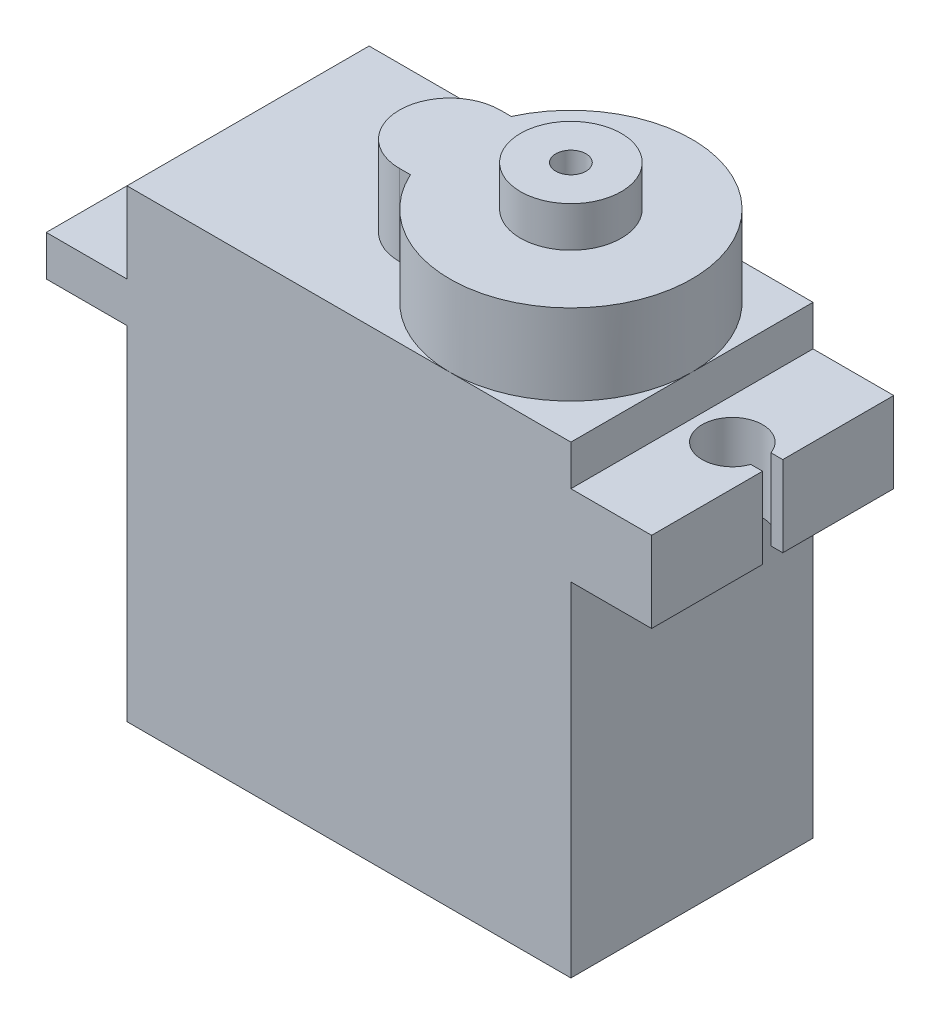
ISO-10303-21;
HEADER;
FILE_DESCRIPTION(('STEP AP214'),'2;1');
FILE_NAME('part.step','',(''),(''),'','','');
FILE_SCHEMA(('AUTOMOTIVE_DESIGN { 1 0 10303 214 1 1 1 1 }'));
ENDSEC;
DATA;
#1=APPLICATION_CONTEXT('core data for automotive mechanical design processes');
#2=APPLICATION_PROTOCOL_DEFINITION('international standard','automotive_design',2000,#1);
#3=PRODUCT_CONTEXT('',#1,'mechanical');
#4=PRODUCT('Part','Part','',(#3));
#5=PRODUCT_RELATED_PRODUCT_CATEGORY('part','',(#4));
#6=PRODUCT_DEFINITION_FORMATION('','',#4);
#7=PRODUCT_DEFINITION_CONTEXT('part definition',#1,'design');
#8=PRODUCT_DEFINITION('design','',#6,#7);
#9=PRODUCT_DEFINITION_SHAPE('','',#8);
#10=(LENGTH_UNIT() NAMED_UNIT(*) SI_UNIT(.MILLI.,.METRE.));
#11=(NAMED_UNIT(*) PLANE_ANGLE_UNIT() SI_UNIT($,.RADIAN.));
#12=(NAMED_UNIT(*) SI_UNIT($,.STERADIAN.) SOLID_ANGLE_UNIT());
#13=UNCERTAINTY_MEASURE_WITH_UNIT(LENGTH_MEASURE(1.E-05),#10,'distance_accuracy_value','');
#14=(GEOMETRIC_REPRESENTATION_CONTEXT(3) GLOBAL_UNCERTAINTY_ASSIGNED_CONTEXT((#13)) GLOBAL_UNIT_ASSIGNED_CONTEXT((#10,
#11,#12)) REPRESENTATION_CONTEXT('',''));
#15=CARTESIAN_POINT('',(0.,0.,0.));
#16=DIRECTION('',(0.,0.,1.));
#17=DIRECTION('',(1.,0.,0.));
#18=AXIS2_PLACEMENT_3D('',#15,#16,#17);
#19=CARTESIAN_POINT('',(-36.1403279553093,11.0751421184563,12.));
#20=DIRECTION('',(0.,-1.,0.));
#21=DIRECTION('',(0.,0.,-1.));
#22=AXIS2_PLACEMENT_3D('',#19,#20,#21);
#23=PLANE('',#22);
#24=DIRECTION('',(1.,0.,0.));
#25=VECTOR('',#24,1.);
#26=CARTESIAN_POINT('',(0.,11.0751421184563,3.5));
#27=LINE('',#26,#25);
#28=CARTESIAN_POINT('',(-26.1403279553093,11.0751421184563,3.5));
#29=VERTEX_POINT('',#28);
#30=CARTESIAN_POINT('',(-25.5946840126272,11.0751421184563,3.5));
#31=VERTEX_POINT('',#30);
#32=EDGE_CURVE('E245',#29,#31,#27,.T.);
#33=ORIENTED_EDGE('',*,*,#32,.T.);
#34=CARTESIAN_POINT('',(-20.1403279553093,11.0751421184563,6.));
#35=DIRECTION('',(0.,1.,0.));
#36=DIRECTION('',(0.,0.,1.));
#37=AXIS2_PLACEMENT_3D('',#34,#35,#36);
#38=CIRCLE('',#37,6.);
#39=CARTESIAN_POINT('',(-20.1403279553093,11.0751421184563,0.));
#40=VERTEX_POINT('',#39);
#41=EDGE_CURVE('E56',#31,#40,#38,.F.);
#42=ORIENTED_EDGE('',*,*,#41,.T.);
#43=DIRECTION('',(-1.,0.,0.));
#44=VECTOR('',#43,1.);
#45=CARTESIAN_POINT('',(-36.1403279553093,11.0751421184563,0.));
#46=LINE('',#45,#44);
#47=CARTESIAN_POINT('',(-36.1403279553093,11.0751421184563,0.));
#48=VERTEX_POINT('',#47);
#49=EDGE_CURVE('E391',#40,#48,#46,.T.);
#50=ORIENTED_EDGE('',*,*,#49,.T.);
#51=DIRECTION('',(0.,0.,-1.));
#52=VECTOR('',#51,1.);
#53=CARTESIAN_POINT('',(-36.1403279553093,11.0751421184563,12.));
#54=LINE('',#53,#52);
#55=CARTESIAN_POINT('',(-36.1403279553093,11.0751421184563,12.));
#56=VERTEX_POINT('',#55);
#57=EDGE_CURVE('E382',#56,#48,#54,.T.);
#58=ORIENTED_EDGE('',*,*,#57,.F.);
#59=DIRECTION('',(-1.,0.,0.));
#60=VECTOR('',#59,1.);
#61=CARTESIAN_POINT('',(-36.1403279553093,11.0751421184563,12.));
#62=LINE('',#61,#60);
#63=CARTESIAN_POINT('',(-20.1403279553093,11.0751421184563,12.));
#64=VERTEX_POINT('',#63);
#65=EDGE_CURVE('E378',#64,#56,#62,.T.);
#66=ORIENTED_EDGE('',*,*,#65,.F.);
#67=CARTESIAN_POINT('',(-25.5946840126272,11.0751421184563,8.5));
#68=VERTEX_POINT('',#67);
#69=EDGE_CURVE('E246',#64,#68,#38,.F.);
#70=ORIENTED_EDGE('',*,*,#69,.T.);
#71=DIRECTION('',(1.,0.,0.));
#72=VECTOR('',#71,1.);
#73=CARTESIAN_POINT('',(0.,11.0751421184563,8.5));
#74=LINE('',#73,#72);
#75=CARTESIAN_POINT('',(-26.1403279553093,11.0751421184563,8.5));
#76=VERTEX_POINT('',#75);
#77=EDGE_CURVE('E235',#76,#68,#74,.T.);
#78=ORIENTED_EDGE('',*,*,#77,.F.);
#79=CARTESIAN_POINT('',(-26.1403279553093,11.0751421184563,6.));
#80=DIRECTION('',(0.,1.,0.));
#81=DIRECTION('',(0.,0.,1.));
#82=AXIS2_PLACEMENT_3D('',#79,#80,#81);
#83=CIRCLE('',#82,2.5);
#84=EDGE_CURVE('E248',#76,#29,#83,.F.);
#85=ORIENTED_EDGE('',*,*,#84,.T.);
#86=EDGE_LOOP('',(#33,#42,#50,#58,#66,#70,#78,#85));
#87=FACE_BOUND('',#86,.T.);
#88=ADVANCED_FACE('F45',(#87),#23,.F.);
#89=CARTESIAN_POINT('',(-14.1403279553093,11.0751421184563,0.));
#90=VERTEX_POINT('',#89);
#91=EDGE_CURVE('E392',#90,#40,#46,.T.);
#92=ORIENTED_EDGE('',*,*,#91,.T.);
#93=CARTESIAN_POINT('',(-14.1403279553093,11.0751421184563,6.));
#94=VERTEX_POINT('',#93);
#95=EDGE_CURVE('E11',#40,#94,#38,.F.);
#96=ORIENTED_EDGE('',*,*,#95,.T.);
#97=DIRECTION('',(0.,0.,-1.));
#98=VECTOR('',#97,1.);
#99=CARTESIAN_POINT('',(-14.1403279553093,11.0751421184563,12.));
#100=LINE('',#99,#98);
#101=EDGE_CURVE('E397',#94,#90,#100,.T.);
#102=ORIENTED_EDGE('',*,*,#101,.T.);
#103=EDGE_LOOP('',(#92,#96,#102));
#104=FACE_BOUND('',#103,.T.);
#105=ADVANCED_FACE('F431',(#104),#23,.F.);
#106=CARTESIAN_POINT('',(-40.1403279553093,0.,0.));
#107=DIRECTION('',(1.,0.,0.));
#108=DIRECTION('',(0.,0.,-1.));
#109=AXIS2_PLACEMENT_3D('',#106,#107,#108);
#110=PLANE('',#109);
#111=DIRECTION('',(0.,0.,1.));
#112=VECTOR('',#111,1.);
#113=CARTESIAN_POINT('',(-40.1403279553093,5.0751421184563,12.));
#114=LINE('',#113,#112);
#115=CARTESIAN_POINT('',(-40.1403279553093,5.0751421184563,0.));
#116=VERTEX_POINT('',#115);
#117=CARTESIAN_POINT('',(-40.1403279553093,5.0751421184563,5.5));
#118=VERTEX_POINT('',#117);
#119=EDGE_CURVE('E286',#116,#118,#114,.T.);
#120=ORIENTED_EDGE('',*,*,#119,.T.);
#121=DIRECTION('',(0.,1.,0.));
#122=VECTOR('',#121,1.);
#123=CARTESIAN_POINT('',(-40.1403279553093,5.0751421184563,5.5));
#124=LINE('',#123,#122);
#125=CARTESIAN_POINT('',(-40.1403279553093,7.0751421184563,5.5));
#126=VERTEX_POINT('',#125);
#127=EDGE_CURVE('E265',#118,#126,#124,.T.);
#128=ORIENTED_EDGE('',*,*,#127,.T.);
#129=DIRECTION('',(0.,0.,-1.));
#130=VECTOR('',#129,1.);
#131=CARTESIAN_POINT('',(-40.1403279553093,7.0751421184563,0.));
#132=LINE('',#131,#130);
#133=CARTESIAN_POINT('',(-40.1403279553093,7.0751421184563,0.));
#134=VERTEX_POINT('',#133);
#135=EDGE_CURVE('E291',#126,#134,#132,.T.);
#136=ORIENTED_EDGE('',*,*,#135,.T.);
#137=DIRECTION('',(0.,-1.,0.));
#138=VECTOR('',#137,1.);
#139=CARTESIAN_POINT('',(-40.1403279553093,5.0751421184563,0.));
#140=LINE('',#139,#138);
#141=EDGE_CURVE('E281',#134,#116,#140,.T.);
#142=ORIENTED_EDGE('',*,*,#141,.T.);
#143=EDGE_LOOP('',(#120,#128,#136,#142));
#144=FACE_BOUND('',#143,.T.);
#145=ADVANCED_FACE('F505',(#144),#110,.F.);
#146=CARTESIAN_POINT('',(-36.1403279553093,-11.9248578815437,12.));
#147=DIRECTION('',(1.,0.,0.));
#148=DIRECTION('',(0.,0.,-1.));
#149=AXIS2_PLACEMENT_3D('',#146,#147,#148);
#150=PLANE('',#149);
#151=DIRECTION('',(0.,0.,-1.));
#152=VECTOR('',#151,1.);
#153=CARTESIAN_POINT('',(-36.1403279553093,7.0751421184563,0.));
#154=LINE('',#153,#152);
#155=CARTESIAN_POINT('',(-36.1403279553093,7.0751421184563,12.));
#156=VERTEX_POINT('',#155);
#157=CARTESIAN_POINT('',(-36.1403279553093,7.0751421184563,0.));
#158=VERTEX_POINT('',#157);
#159=EDGE_CURVE('E285',#156,#158,#154,.T.);
#160=ORIENTED_EDGE('',*,*,#159,.F.);
#161=DIRECTION('',(0.,-1.,0.));
#162=VECTOR('',#161,1.);
#163=CARTESIAN_POINT('',(-36.1403279553093,-11.9248578815437,12.));
#164=LINE('',#163,#162);
#165=EDGE_CURVE('E368',#56,#156,#164,.T.);
#166=ORIENTED_EDGE('',*,*,#165,.F.);
#167=ORIENTED_EDGE('',*,*,#57,.T.);
#168=DIRECTION('',(0.,-1.,0.));
#169=VECTOR('',#168,1.);
#170=CARTESIAN_POINT('',(-36.1403279553093,-11.9248578815437,0.));
#171=LINE('',#170,#169);
#172=EDGE_CURVE('E383',#48,#158,#171,.T.);
#173=ORIENTED_EDGE('',*,*,#172,.T.);
#174=EDGE_LOOP('',(#160,#166,#167,#173));
#175=FACE_BOUND('',#174,.T.);
#176=ADVANCED_FACE('F47',(#175),#150,.F.);
#177=DIRECTION('',(0.,0.,1.));
#178=VECTOR('',#177,1.);
#179=CARTESIAN_POINT('',(-36.1403279553093,5.0751421184563,12.));
#180=LINE('',#179,#178);
#181=CARTESIAN_POINT('',(-36.1403279553093,5.0751421184563,0.));
#182=VERTEX_POINT('',#181);
#183=CARTESIAN_POINT('',(-36.1403279553093,5.0751421184563,12.));
#184=VERTEX_POINT('',#183);
#185=EDGE_CURVE('E274',#182,#184,#180,.T.);
#186=ORIENTED_EDGE('',*,*,#185,.F.);
#187=CARTESIAN_POINT('',(-36.1403279553093,-11.9248578815437,0.));
#188=VERTEX_POINT('',#187);
#189=EDGE_CURVE('E367',#182,#188,#171,.T.);
#190=ORIENTED_EDGE('',*,*,#189,.T.);
#191=DIRECTION('',(0.,0.,-1.));
#192=VECTOR('',#191,1.);
#193=CARTESIAN_POINT('',(-36.1403279553093,-11.9248578815437,12.));
#194=LINE('',#193,#192);
#195=CARTESIAN_POINT('',(-36.1403279553093,-11.9248578815437,12.));
#196=VERTEX_POINT('',#195);
#197=EDGE_CURVE('E403',#196,#188,#194,.T.);
#198=ORIENTED_EDGE('',*,*,#197,.F.);
#199=EDGE_CURVE('E372',#184,#196,#164,.T.);
#200=ORIENTED_EDGE('',*,*,#199,.F.);
#201=EDGE_LOOP('',(#186,#190,#198,#200));
#202=FACE_BOUND('',#201,.T.);
#203=ADVANCED_FACE('F456',(#202),#150,.F.);
#204=CARTESIAN_POINT('',(0.,0.,12.));
#205=DIRECTION('',(0.,0.,-1.));
#206=DIRECTION('',(-1.,0.,0.));
#207=AXIS2_PLACEMENT_3D('',#204,#205,#206);
#208=PLANE('',#207);
#209=DIRECTION('',(0.,1.,0.));
#210=VECTOR('',#209,1.);
#211=CARTESIAN_POINT('',(-10.1403279553093,5.0751421184563,12.));
#212=LINE('',#211,#210);
#213=CARTESIAN_POINT('',(-10.1403279553093,5.0751421184563,12.));
#214=VERTEX_POINT('',#213);
#215=CARTESIAN_POINT('',(-10.1403279553093,9.07514211845631,12.));
#216=VERTEX_POINT('',#215);
#217=EDGE_CURVE('E349',#214,#216,#212,.T.);
#218=ORIENTED_EDGE('',*,*,#217,.T.);
#219=DIRECTION('',(-1.,0.,0.));
#220=VECTOR('',#219,1.);
#221=CARTESIAN_POINT('',(-9.1403279553093,9.0751421184563,12.));
#222=LINE('',#221,#220);
#223=CARTESIAN_POINT('',(-14.1403279553093,9.0751421184563,12.));
#224=VERTEX_POINT('',#223);
#225=EDGE_CURVE('E329',#216,#224,#222,.T.);
#226=ORIENTED_EDGE('',*,*,#225,.T.);
#227=DIRECTION('',(0.,1.,0.));
#228=VECTOR('',#227,1.);
#229=CARTESIAN_POINT('',(-14.1403279553093,11.0751421184563,12.));
#230=LINE('',#229,#228);
#231=CARTESIAN_POINT('',(-14.1403279553093,11.0751421184563,12.));
#232=VERTEX_POINT('',#231);
#233=EDGE_CURVE('E374',#224,#232,#230,.T.);
#234=ORIENTED_EDGE('',*,*,#233,.T.);
#235=EDGE_CURVE('E379',#232,#64,#62,.T.);
#236=ORIENTED_EDGE('',*,*,#235,.T.);
#237=ORIENTED_EDGE('',*,*,#65,.T.);
#238=ORIENTED_EDGE('',*,*,#165,.T.);
#239=DIRECTION('',(1.,0.,0.));
#240=VECTOR('',#239,1.);
#241=CARTESIAN_POINT('',(-40.1403279553093,7.0751421184563,12.));
#242=LINE('',#241,#240);
#243=CARTESIAN_POINT('',(-40.1403279553093,7.0751421184563,12.));
#244=VERTEX_POINT('',#243);
#245=EDGE_CURVE('E302',#244,#156,#242,.T.);
#246=ORIENTED_EDGE('',*,*,#245,.F.);
#247=DIRECTION('',(0.,1.,0.));
#248=VECTOR('',#247,1.);
#249=CARTESIAN_POINT('',(-40.1403279553093,7.0751421184563,12.));
#250=LINE('',#249,#248);
#251=CARTESIAN_POINT('',(-40.1403279553093,5.0751421184563,12.));
#252=VERTEX_POINT('',#251);
#253=EDGE_CURVE('E289',#252,#244,#250,.T.);
#254=ORIENTED_EDGE('',*,*,#253,.F.);
#255=DIRECTION('',(1.,0.,0.));
#256=VECTOR('',#255,1.);
#257=CARTESIAN_POINT('',(-40.1403279553093,5.0751421184563,12.));
#258=LINE('',#257,#256);
#259=EDGE_CURVE('E305',#252,#184,#258,.T.);
#260=ORIENTED_EDGE('',*,*,#259,.T.);
#261=ORIENTED_EDGE('',*,*,#199,.T.);
#262=DIRECTION('',(1.,0.,0.));
#263=VECTOR('',#262,1.);
#264=CARTESIAN_POINT('',(-14.1403279553093,-11.9248578815437,12.));
#265=LINE('',#264,#263);
#266=CARTESIAN_POINT('',(-14.1403279553093,-11.9248578815437,12.));
#267=VERTEX_POINT('',#266);
#268=EDGE_CURVE('E371',#196,#267,#265,.T.);
#269=ORIENTED_EDGE('',*,*,#268,.T.);
#270=CARTESIAN_POINT('',(-14.1403279553093,5.0751421184563,12.));
#271=VERTEX_POINT('',#270);
#272=EDGE_CURVE('E375',#267,#271,#230,.T.);
#273=ORIENTED_EDGE('',*,*,#272,.T.);
#274=DIRECTION('',(-1.,0.,0.));
#275=VECTOR('',#274,1.);
#276=CARTESIAN_POINT('',(-9.1403279553093,5.0751421184563,12.));
#277=LINE('',#276,#275);
#278=EDGE_CURVE('E365',#214,#271,#277,.T.);
#279=ORIENTED_EDGE('',*,*,#278,.F.);
#280=EDGE_LOOP('',(#218,#226,#234,#236,#237,#238,#246,#254,#260,#261,#269,#273,#279));
#281=FACE_BOUND('',#280,.T.);
#282=ADVANCED_FACE('F420',(#281),#208,.F.);
#283=CARTESIAN_POINT('',(0.,0.,0.));
#284=DIRECTION('',(0.,0.,-1.));
#285=DIRECTION('',(-1.,0.,0.));
#286=AXIS2_PLACEMENT_3D('',#283,#284,#285);
#287=PLANE('',#286);
#288=DIRECTION('',(-1.,0.,0.));
#289=VECTOR('',#288,1.);
#290=CARTESIAN_POINT('',(-9.1403279553093,9.07514211845631,0.));
#291=LINE('',#290,#289);
#292=CARTESIAN_POINT('',(-10.1403279553093,9.07514211845631,0.));
#293=VERTEX_POINT('',#292);
#294=CARTESIAN_POINT('',(-14.1403279553093,9.07514211845631,0.));
#295=VERTEX_POINT('',#294);
#296=EDGE_CURVE('E331',#293,#295,#291,.T.);
#297=ORIENTED_EDGE('',*,*,#296,.F.);
#298=DIRECTION('',(0.,1.,0.));
#299=VECTOR('',#298,1.);
#300=CARTESIAN_POINT('',(-10.1403279553093,5.0751421184563,0.));
#301=LINE('',#300,#299);
#302=CARTESIAN_POINT('',(-10.1403279553093,5.0751421184563,0.));
#303=VERTEX_POINT('',#302);
#304=EDGE_CURVE('E348',#303,#293,#301,.T.);
#305=ORIENTED_EDGE('',*,*,#304,.F.);
#306=DIRECTION('',(-1.,0.,0.));
#307=VECTOR('',#306,1.);
#308=CARTESIAN_POINT('',(-9.1403279553093,5.0751421184563,0.));
#309=LINE('',#308,#307);
#310=CARTESIAN_POINT('',(-14.1403279553093,5.0751421184563,0.));
#311=VERTEX_POINT('',#310);
#312=EDGE_CURVE('E363',#303,#311,#309,.T.);
#313=ORIENTED_EDGE('',*,*,#312,.T.);
#314=DIRECTION('',(0.,1.,0.));
#315=VECTOR('',#314,1.);
#316=CARTESIAN_POINT('',(-14.1403279553093,11.0751421184563,0.));
#317=LINE('',#316,#315);
#318=CARTESIAN_POINT('',(-14.1403279553093,-11.9248578815437,0.));
#319=VERTEX_POINT('',#318);
#320=EDGE_CURVE('E388',#319,#311,#317,.T.);
#321=ORIENTED_EDGE('',*,*,#320,.F.);
#322=DIRECTION('',(1.,0.,0.));
#323=VECTOR('',#322,1.);
#324=CARTESIAN_POINT('',(-14.1403279553093,-11.9248578815437,0.));
#325=LINE('',#324,#323);
#326=EDGE_CURVE('E385',#188,#319,#325,.T.);
#327=ORIENTED_EDGE('',*,*,#326,.F.);
#328=ORIENTED_EDGE('',*,*,#189,.F.);
#329=DIRECTION('',(1.,0.,0.));
#330=VECTOR('',#329,1.);
#331=CARTESIAN_POINT('',(-40.1403279553093,5.0751421184563,0.));
#332=LINE('',#331,#330);
#333=EDGE_CURVE('E308',#116,#182,#332,.T.);
#334=ORIENTED_EDGE('',*,*,#333,.F.);
#335=ORIENTED_EDGE('',*,*,#141,.F.);
#336=DIRECTION('',(1.,0.,0.));
#337=VECTOR('',#336,1.);
#338=CARTESIAN_POINT('',(-40.1403279553093,7.0751421184563,0.));
#339=LINE('',#338,#337);
#340=EDGE_CURVE('E295',#134,#158,#339,.T.);
#341=ORIENTED_EDGE('',*,*,#340,.T.);
#342=ORIENTED_EDGE('',*,*,#172,.F.);
#343=ORIENTED_EDGE('',*,*,#49,.F.);
#344=ORIENTED_EDGE('',*,*,#91,.F.);
#345=EDGE_CURVE('E387',#295,#90,#317,.T.);
#346=ORIENTED_EDGE('',*,*,#345,.F.);
#347=EDGE_LOOP('',(#297,#305,#313,#321,#327,#328,#334,#335,#341,#342,#343,#344,#346));
#348=FACE_BOUND('',#347,.T.);
#349=ADVANCED_FACE('F436',(#348),#287,.T.);
#350=CARTESIAN_POINT('',(-9.1403279553093,9.07514211845631,0.));
#351=DIRECTION('',(0.,1.,0.));
#352=DIRECTION('',(-1.,0.,0.));
#353=AXIS2_PLACEMENT_3D('',#350,#351,#352);
#354=PLANE('',#353);
#355=DIRECTION('',(-1.,0.,0.));
#356=VECTOR('',#355,1.);
#357=CARTESIAN_POINT('',(-10.1403279553093,9.07514211845631,5.5));
#358=LINE('',#357,#356);
#359=CARTESIAN_POINT('',(-10.1403279553093,9.07514211845631,5.5));
#360=VERTEX_POINT('',#359);
#361=CARTESIAN_POINT('',(-10.7261143929362,9.07514211845631,5.5));
#362=VERTEX_POINT('',#361);
#363=EDGE_CURVE('E320',#360,#362,#358,.T.);
#364=ORIENTED_EDGE('',*,*,#363,.F.);
#365=DIRECTION('',(0.,0.,1.));
#366=VECTOR('',#365,1.);
#367=CARTESIAN_POINT('',(-10.1403279553093,9.07514211845631,5.5));
#368=LINE('',#367,#366);
#369=EDGE_CURVE('E323',#293,#360,#368,.T.);
#370=ORIENTED_EDGE('',*,*,#369,.F.);
#371=ORIENTED_EDGE('',*,*,#296,.T.);
#372=DIRECTION('',(0.,0.,-1.));
#373=VECTOR('',#372,1.);
#374=CARTESIAN_POINT('',(-14.1403279553093,9.07514211845631,0.));
#375=LINE('',#374,#373);
#376=EDGE_CURVE('E326',#224,#295,#375,.T.);
#377=ORIENTED_EDGE('',*,*,#376,.F.);
#378=ORIENTED_EDGE('',*,*,#225,.F.);
#379=DIRECTION('',(0.,0.,1.));
#380=VECTOR('',#379,1.);
#381=CARTESIAN_POINT('',(-10.1403279553093,9.07514211845631,12.));
#382=LINE('',#381,#380);
#383=CARTESIAN_POINT('',(-10.1403279553093,9.07514211845631,6.5));
#384=VERTEX_POINT('',#383);
#385=EDGE_CURVE('E311',#384,#216,#382,.T.);
#386=ORIENTED_EDGE('',*,*,#385,.F.);
#387=DIRECTION('',(1.,0.,0.));
#388=VECTOR('',#387,1.);
#389=CARTESIAN_POINT('',(-10.7261143929362,9.07514211845631,6.5));
#390=LINE('',#389,#388);
#391=CARTESIAN_POINT('',(-10.7261143929362,9.07514211845631,6.5));
#392=VERTEX_POINT('',#391);
#393=EDGE_CURVE('E314',#392,#384,#390,.T.);
#394=ORIENTED_EDGE('',*,*,#393,.F.);
#395=CARTESIAN_POINT('',(-12.1403279553093,9.07514211845631,6.));
#396=DIRECTION('',(0.,1.,0.));
#397=DIRECTION('',(1.,0.,0.));
#398=AXIS2_PLACEMENT_3D('',#395,#396,#397);
#399=CIRCLE('',#398,1.5);
#400=EDGE_CURVE('E317',#362,#392,#399,.T.);
#401=ORIENTED_EDGE('',*,*,#400,.F.);
#402=EDGE_LOOP('',(#364,#370,#371,#377,#378,#386,#394,#401));
#403=FACE_BOUND('',#402,.T.);
#404=ADVANCED_FACE('F477',(#403),#354,.T.);
#405=CARTESIAN_POINT('',(-14.1403279553093,11.0751421184563,12.));
#406=DIRECTION('',(-1.,0.,0.));
#407=DIRECTION('',(0.,-1.,0.));
#408=AXIS2_PLACEMENT_3D('',#405,#406,#407);
#409=PLANE('',#408);
#410=ORIENTED_EDGE('',*,*,#233,.F.);
#411=ORIENTED_EDGE('',*,*,#376,.T.);
#412=ORIENTED_EDGE('',*,*,#345,.T.);
#413=ORIENTED_EDGE('',*,*,#101,.F.);
#414=EDGE_CURVE('E398',#232,#94,#100,.T.);
#415=ORIENTED_EDGE('',*,*,#414,.F.);
#416=EDGE_LOOP('',(#410,#411,#412,#413,#415));
#417=FACE_BOUND('',#416,.T.);
#418=ADVANCED_FACE('F426',(#417),#409,.F.);
#419=DIRECTION('',(0.,0.,-1.));
#420=VECTOR('',#419,1.);
#421=CARTESIAN_POINT('',(-14.1403279553093,5.0751421184563,0.));
#422=LINE('',#421,#420);
#423=EDGE_CURVE('E351',#271,#311,#422,.T.);
#424=ORIENTED_EDGE('',*,*,#423,.F.);
#425=ORIENTED_EDGE('',*,*,#272,.F.);
#426=DIRECTION('',(0.,0.,-1.));
#427=VECTOR('',#426,1.);
#428=CARTESIAN_POINT('',(-14.1403279553093,-11.9248578815437,12.));
#429=LINE('',#428,#427);
#430=EDGE_CURVE('E401',#267,#319,#429,.T.);
#431=ORIENTED_EDGE('',*,*,#430,.T.);
#432=ORIENTED_EDGE('',*,*,#320,.T.);
#433=EDGE_LOOP('',(#424,#425,#431,#432));
#434=FACE_BOUND('',#433,.T.);
#435=ADVANCED_FACE('F464',(#434),#409,.F.);
#436=CARTESIAN_POINT('',(-14.1403279553093,-11.9248578815437,12.));
#437=DIRECTION('',(0.,1.,0.));
#438=DIRECTION('',(0.,0.,1.));
#439=AXIS2_PLACEMENT_3D('',#436,#437,#438);
#440=PLANE('',#439);
#441=ORIENTED_EDGE('',*,*,#326,.T.);
#442=ORIENTED_EDGE('',*,*,#430,.F.);
#443=ORIENTED_EDGE('',*,*,#268,.F.);
#444=ORIENTED_EDGE('',*,*,#197,.T.);
#445=EDGE_LOOP('',(#441,#442,#443,#444));
#446=FACE_BOUND('',#445,.T.);
#447=ADVANCED_FACE('F460',(#446),#440,.F.);
#448=ORIENTED_EDGE('',*,*,#414,.T.);
#449=EDGE_CURVE('E54',#94,#64,#38,.F.);
#450=ORIENTED_EDGE('',*,*,#449,.T.);
#451=ORIENTED_EDGE('',*,*,#235,.F.);
#452=EDGE_LOOP('',(#448,#450,#451));
#453=FACE_BOUND('',#452,.T.);
#454=ADVANCED_FACE('F415',(#453),#23,.F.);
#455=CARTESIAN_POINT('',(-9.1403279553093,5.0751421184563,0.));
#456=DIRECTION('',(0.,1.,0.));
#457=DIRECTION('',(-1.,0.,0.));
#458=AXIS2_PLACEMENT_3D('',#455,#456,#457);
#459=PLANE('',#458);
#460=DIRECTION('',(1.,0.,0.));
#461=VECTOR('',#460,1.);
#462=CARTESIAN_POINT('',(-10.7261143929362,5.0751421184563,6.5));
#463=LINE('',#462,#461);
#464=CARTESIAN_POINT('',(-10.7261143929362,5.0751421184563,6.5));
#465=VERTEX_POINT('',#464);
#466=CARTESIAN_POINT('',(-10.1403279553093,5.0751421184563,6.5));
#467=VERTEX_POINT('',#466);
#468=EDGE_CURVE('E342',#465,#467,#463,.T.);
#469=ORIENTED_EDGE('',*,*,#468,.T.);
#470=DIRECTION('',(0.,0.,1.));
#471=VECTOR('',#470,1.);
#472=CARTESIAN_POINT('',(-10.1403279553093,5.0751421184563,12.));
#473=LINE('',#472,#471);
#474=EDGE_CURVE('E345',#467,#214,#473,.T.);
#475=ORIENTED_EDGE('',*,*,#474,.T.);
#476=ORIENTED_EDGE('',*,*,#278,.T.);
#477=ORIENTED_EDGE('',*,*,#423,.T.);
#478=ORIENTED_EDGE('',*,*,#312,.F.);
#479=DIRECTION('',(0.,0.,1.));
#480=VECTOR('',#479,1.);
#481=CARTESIAN_POINT('',(-10.1403279553093,5.0751421184563,5.5));
#482=LINE('',#481,#480);
#483=CARTESIAN_POINT('',(-10.1403279553093,5.0751421184563,5.5));
#484=VERTEX_POINT('',#483);
#485=EDGE_CURVE('E333',#303,#484,#482,.T.);
#486=ORIENTED_EDGE('',*,*,#485,.T.);
#487=DIRECTION('',(-1.,0.,0.));
#488=VECTOR('',#487,1.);
#489=CARTESIAN_POINT('',(-10.1403279553093,5.0751421184563,5.5));
#490=LINE('',#489,#488);
#491=CARTESIAN_POINT('',(-10.7261143929362,5.0751421184563,5.5));
#492=VERTEX_POINT('',#491);
#493=EDGE_CURVE('E336',#484,#492,#490,.T.);
#494=ORIENTED_EDGE('',*,*,#493,.T.);
#495=CARTESIAN_POINT('',(-12.1403279553093,5.0751421184563,6.));
#496=DIRECTION('',(0.,1.,0.));
#497=DIRECTION('',(1.,0.,0.));
#498=AXIS2_PLACEMENT_3D('',#495,#496,#497);
#499=CIRCLE('',#498,1.5);
#500=EDGE_CURVE('E339',#492,#465,#499,.T.);
#501=ORIENTED_EDGE('',*,*,#500,.T.);
#502=EDGE_LOOP('',(#469,#475,#476,#477,#478,#486,#494,#501));
#503=FACE_BOUND('',#502,.T.);
#504=ADVANCED_FACE('F467',(#503),#459,.F.);
#505=CARTESIAN_POINT('',(-10.1403279553093,5.0751421184563,12.));
#506=DIRECTION('',(-1.,0.,0.));
#507=DIRECTION('',(0.,-1.,0.));
#508=AXIS2_PLACEMENT_3D('',#505,#506,#507);
#509=PLANE('',#508);
#510=DIRECTION('',(0.,1.,0.));
#511=VECTOR('',#510,1.);
#512=CARTESIAN_POINT('',(-10.1403279553093,5.0751421184563,6.5));
#513=LINE('',#512,#511);
#514=EDGE_CURVE('E352',#467,#384,#513,.T.);
#515=ORIENTED_EDGE('',*,*,#514,.T.);
#516=ORIENTED_EDGE('',*,*,#385,.T.);
#517=ORIENTED_EDGE('',*,*,#217,.F.);
#518=ORIENTED_EDGE('',*,*,#474,.F.);
#519=EDGE_LOOP('',(#515,#516,#517,#518));
#520=FACE_BOUND('',#519,.T.);
#521=ADVANCED_FACE('F472',(#520),#509,.F.);
#522=CARTESIAN_POINT('',(-10.7261143929362,5.0751421184563,6.5));
#523=DIRECTION('',(0.,0.,1.));
#524=DIRECTION('',(1.,0.,0.));
#525=AXIS2_PLACEMENT_3D('',#522,#523,#524);
#526=PLANE('',#525);
#527=DIRECTION('',(0.,1.,0.));
#528=VECTOR('',#527,1.);
#529=CARTESIAN_POINT('',(-10.7261143929362,5.0751421184563,6.5));
#530=LINE('',#529,#528);
#531=EDGE_CURVE('E354',#465,#392,#530,.T.);
#532=ORIENTED_EDGE('',*,*,#531,.T.);
#533=ORIENTED_EDGE('',*,*,#393,.T.);
#534=ORIENTED_EDGE('',*,*,#514,.F.);
#535=ORIENTED_EDGE('',*,*,#468,.F.);
#536=EDGE_LOOP('',(#532,#533,#534,#535));
#537=FACE_BOUND('',#536,.T.);
#538=ADVANCED_FACE('F490',(#537),#526,.F.);
#539=CARTESIAN_POINT('',(-12.1403279553093,5.0751421184563,6.));
#540=DIRECTION('',(0.,1.,0.));
#541=DIRECTION('',(-1.,0.,0.));
#542=AXIS2_PLACEMENT_3D('',#539,#540,#541);
#543=CYLINDRICAL_SURFACE('',#542,1.5);
#544=DIRECTION('',(0.,1.,0.));
#545=VECTOR('',#544,1.);
#546=CARTESIAN_POINT('',(-10.7261143929362,5.0751421184563,5.5));
#547=LINE('',#546,#545);
#548=EDGE_CURVE('E356',#492,#362,#547,.T.);
#549=ORIENTED_EDGE('',*,*,#548,.T.);
#550=ORIENTED_EDGE('',*,*,#400,.T.);
#551=ORIENTED_EDGE('',*,*,#531,.F.);
#552=ORIENTED_EDGE('',*,*,#500,.F.);
#553=EDGE_LOOP('',(#549,#550,#551,#552));
#554=FACE_BOUND('',#553,.T.);
#555=ADVANCED_FACE('F488',(#554),#543,.F.);
#556=CARTESIAN_POINT('',(-10.1403279553093,5.0751421184563,5.5));
#557=DIRECTION('',(0.,0.,-1.));
#558=DIRECTION('',(-1.,0.,0.));
#559=AXIS2_PLACEMENT_3D('',#556,#557,#558);
#560=PLANE('',#559);
#561=DIRECTION('',(0.,1.,0.));
#562=VECTOR('',#561,1.);
#563=CARTESIAN_POINT('',(-10.1403279553093,5.0751421184563,5.5));
#564=LINE('',#563,#562);
#565=EDGE_CURVE('E358',#484,#360,#564,.T.);
#566=ORIENTED_EDGE('',*,*,#565,.T.);
#567=ORIENTED_EDGE('',*,*,#363,.T.);
#568=ORIENTED_EDGE('',*,*,#548,.F.);
#569=ORIENTED_EDGE('',*,*,#493,.F.);
#570=EDGE_LOOP('',(#566,#567,#568,#569));
#571=FACE_BOUND('',#570,.T.);
#572=ADVANCED_FACE('F484',(#571),#560,.F.);
#573=CARTESIAN_POINT('',(-10.1403279553093,5.0751421184563,5.5));
#574=DIRECTION('',(-1.,0.,0.));
#575=DIRECTION('',(0.,-1.,0.));
#576=AXIS2_PLACEMENT_3D('',#573,#574,#575);
#577=PLANE('',#576);
#578=ORIENTED_EDGE('',*,*,#304,.T.);
#579=ORIENTED_EDGE('',*,*,#369,.T.);
#580=ORIENTED_EDGE('',*,*,#565,.F.);
#581=ORIENTED_EDGE('',*,*,#485,.F.);
#582=EDGE_LOOP('',(#578,#579,#580,#581));
#583=FACE_BOUND('',#582,.T.);
#584=ADVANCED_FACE('F482',(#583),#577,.F.);
#585=CARTESIAN_POINT('',(-40.1403279553093,5.0751421184563,12.));
#586=DIRECTION('',(0.,1.,0.));
#587=DIRECTION('',(0.,0.,1.));
#588=AXIS2_PLACEMENT_3D('',#585,#586,#587);
#589=PLANE('',#588);
#590=CARTESIAN_POINT('',(-38.1403279553093,5.0751421184563,6.));
#591=DIRECTION('',(0.,1.,0.));
#592=DIRECTION('',(0.,0.,-1.));
#593=AXIS2_PLACEMENT_3D('',#590,#591,#592);
#594=CIRCLE('',#593,1.5);
#595=CARTESIAN_POINT('',(-39.5545415176824,5.0751421184563,6.5));
#596=VERTEX_POINT('',#595);
#597=CARTESIAN_POINT('',(-39.5545415176824,5.0751421184563,5.5));
#598=VERTEX_POINT('',#597);
#599=EDGE_CURVE('E262',#596,#598,#594,.T.);
#600=ORIENTED_EDGE('',*,*,#599,.T.);
#601=DIRECTION('',(-1.,0.,0.));
#602=VECTOR('',#601,1.);
#603=CARTESIAN_POINT('',(-40.1403279553093,5.0751421184563,5.5));
#604=LINE('',#603,#602);
#605=EDGE_CURVE('E257',#598,#118,#604,.T.);
#606=ORIENTED_EDGE('',*,*,#605,.T.);
#607=ORIENTED_EDGE('',*,*,#119,.F.);
#608=ORIENTED_EDGE('',*,*,#333,.T.);
#609=ORIENTED_EDGE('',*,*,#185,.T.);
#610=ORIENTED_EDGE('',*,*,#259,.F.);
#611=CARTESIAN_POINT('',(-40.1403279553093,5.0751421184563,6.5));
#612=VERTEX_POINT('',#611);
#613=EDGE_CURVE('E284',#612,#252,#114,.T.);
#614=ORIENTED_EDGE('',*,*,#613,.F.);
#615=DIRECTION('',(1.,0.,0.));
#616=VECTOR('',#615,1.);
#617=CARTESIAN_POINT('',(-40.1403279553093,5.0751421184563,6.5));
#618=LINE('',#617,#616);
#619=EDGE_CURVE('E70',#612,#596,#618,.T.);
#620=ORIENTED_EDGE('',*,*,#619,.T.);
#621=EDGE_LOOP('',(#600,#606,#607,#608,#609,#610,#614,#620));
#622=FACE_BOUND('',#621,.T.);
#623=ADVANCED_FACE('F452',(#622),#589,.F.);
#624=CARTESIAN_POINT('',(-40.1403279553093,7.0751421184563,0.));
#625=DIRECTION('',(0.,-1.,0.));
#626=DIRECTION('',(0.,0.,-1.));
#627=AXIS2_PLACEMENT_3D('',#624,#625,#626);
#628=PLANE('',#627);
#629=ORIENTED_EDGE('',*,*,#135,.F.);
#630=DIRECTION('',(-1.,0.,0.));
#631=VECTOR('',#630,1.);
#632=CARTESIAN_POINT('',(-40.1403279553093,7.0751421184563,5.5));
#633=LINE('',#632,#631);
#634=CARTESIAN_POINT('',(-39.5545415176824,7.0751421184563,5.5));
#635=VERTEX_POINT('',#634);
#636=EDGE_CURVE('E223',#635,#126,#633,.T.);
#637=ORIENTED_EDGE('',*,*,#636,.F.);
#638=CARTESIAN_POINT('',(-38.1403279553093,7.0751421184563,6.));
#639=DIRECTION('',(0.,1.,0.));
#640=DIRECTION('',(0.,0.,-1.));
#641=AXIS2_PLACEMENT_3D('',#638,#639,#640);
#642=CIRCLE('',#641,1.5);
#643=CARTESIAN_POINT('',(-39.5545415176824,7.0751421184563,6.5));
#644=VERTEX_POINT('',#643);
#645=EDGE_CURVE('E260',#644,#635,#642,.T.);
#646=ORIENTED_EDGE('',*,*,#645,.F.);
#647=DIRECTION('',(1.,0.,0.));
#648=VECTOR('',#647,1.);
#649=CARTESIAN_POINT('',(-40.1403279553093,7.0751421184563,6.5));
#650=LINE('',#649,#648);
#651=CARTESIAN_POINT('',(-40.1403279553093,7.0751421184563,6.5));
#652=VERTEX_POINT('',#651);
#653=EDGE_CURVE('E267',#652,#644,#650,.T.);
#654=ORIENTED_EDGE('',*,*,#653,.F.);
#655=EDGE_CURVE('E292',#244,#652,#132,.T.);
#656=ORIENTED_EDGE('',*,*,#655,.F.);
#657=ORIENTED_EDGE('',*,*,#245,.T.);
#658=ORIENTED_EDGE('',*,*,#159,.T.);
#659=ORIENTED_EDGE('',*,*,#340,.F.);
#660=EDGE_LOOP('',(#629,#637,#646,#654,#656,#657,#658,#659));
#661=FACE_BOUND('',#660,.T.);
#662=ADVANCED_FACE('F442',(#661),#628,.F.);
#663=ORIENTED_EDGE('',*,*,#655,.T.);
#664=DIRECTION('',(0.,1.,0.));
#665=VECTOR('',#664,1.);
#666=CARTESIAN_POINT('',(-40.1403279553093,5.0751421184563,6.5));
#667=LINE('',#666,#665);
#668=EDGE_CURVE('E277',#612,#652,#667,.T.);
#669=ORIENTED_EDGE('',*,*,#668,.F.);
#670=ORIENTED_EDGE('',*,*,#613,.T.);
#671=ORIENTED_EDGE('',*,*,#253,.T.);
#672=EDGE_LOOP('',(#663,#669,#670,#671));
#673=FACE_BOUND('',#672,.T.);
#674=ADVANCED_FACE('F449',(#673),#110,.F.);
#675=CARTESIAN_POINT('',(-40.1403279553093,5.0751421184563,5.5));
#676=DIRECTION('',(0.,0.,-1.));
#677=DIRECTION('',(-1.,0.,0.));
#678=AXIS2_PLACEMENT_3D('',#675,#676,#677);
#679=PLANE('',#678);
#680=ORIENTED_EDGE('',*,*,#636,.T.);
#681=ORIENTED_EDGE('',*,*,#127,.F.);
#682=ORIENTED_EDGE('',*,*,#605,.F.);
#683=DIRECTION('',(0.,1.,0.));
#684=VECTOR('',#683,1.);
#685=CARTESIAN_POINT('',(-39.5545415176824,5.0751421184563,5.5));
#686=LINE('',#685,#684);
#687=EDGE_CURVE('E272',#598,#635,#686,.T.);
#688=ORIENTED_EDGE('',*,*,#687,.T.);
#689=EDGE_LOOP('',(#680,#681,#682,#688));
#690=FACE_BOUND('',#689,.T.);
#691=ADVANCED_FACE('F533',(#690),#679,.F.);
#692=CARTESIAN_POINT('',(-38.1403279553093,5.0751421184563,6.));
#693=DIRECTION('',(0.,1.,0.));
#694=DIRECTION('',(0.,0.,1.));
#695=AXIS2_PLACEMENT_3D('',#692,#693,#694);
#696=CYLINDRICAL_SURFACE('',#695,1.5);
#697=ORIENTED_EDGE('',*,*,#645,.T.);
#698=ORIENTED_EDGE('',*,*,#687,.F.);
#699=ORIENTED_EDGE('',*,*,#599,.F.);
#700=DIRECTION('',(0.,1.,0.));
#701=VECTOR('',#700,1.);
#702=CARTESIAN_POINT('',(-39.5545415176824,5.0751421184563,6.5));
#703=LINE('',#702,#701);
#704=EDGE_CURVE('E275',#596,#644,#703,.T.);
#705=ORIENTED_EDGE('',*,*,#704,.T.);
#706=EDGE_LOOP('',(#697,#698,#699,#705));
#707=FACE_BOUND('',#706,.T.);
#708=ADVANCED_FACE('F536',(#707),#696,.F.);
#709=CARTESIAN_POINT('',(-40.1403279553093,5.0751421184563,6.5));
#710=DIRECTION('',(0.,0.,1.));
#711=DIRECTION('',(1.,0.,0.));
#712=AXIS2_PLACEMENT_3D('',#709,#710,#711);
#713=PLANE('',#712);
#714=ORIENTED_EDGE('',*,*,#653,.T.);
#715=ORIENTED_EDGE('',*,*,#704,.F.);
#716=ORIENTED_EDGE('',*,*,#619,.F.);
#717=ORIENTED_EDGE('',*,*,#668,.T.);
#718=EDGE_LOOP('',(#714,#715,#716,#717));
#719=FACE_BOUND('',#718,.T.);
#720=ADVANCED_FACE('F538',(#719),#713,.F.);
#721=CARTESIAN_POINT('',(-20.1403279553093,15.0751421184563,6.));
#722=DIRECTION('',(0.,-1.,0.));
#723=DIRECTION('',(0.,0.,-1.));
#724=AXIS2_PLACEMENT_3D('',#721,#722,#723);
#725=CYLINDRICAL_SURFACE('',#724,6.);
#726=ORIENTED_EDGE('',*,*,#41,.F.);
#727=DIRECTION('',(0.,-1.,0.));
#728=VECTOR('',#727,1.);
#729=CARTESIAN_POINT('',(-25.5946840126272,15.0751421184563,3.5));
#730=LINE('',#729,#728);
#731=CARTESIAN_POINT('',(-25.5946840126272,15.0751421184563,3.5));
#732=VERTEX_POINT('',#731);
#733=EDGE_CURVE('E215',#732,#31,#730,.T.);
#734=ORIENTED_EDGE('',*,*,#733,.F.);
#735=CARTESIAN_POINT('',(-20.1403279553093,15.0751421184563,6.));
#736=DIRECTION('',(0.,1.,0.));
#737=DIRECTION('',(0.,0.,1.));
#738=AXIS2_PLACEMENT_3D('',#735,#736,#737);
#739=CIRCLE('',#738,6.);
#740=CARTESIAN_POINT('',(-25.5946840126272,15.0751421184563,8.5));
#741=VERTEX_POINT('',#740);
#742=EDGE_CURVE('E218',#732,#741,#739,.F.);
#743=ORIENTED_EDGE('',*,*,#742,.T.);
#744=DIRECTION('',(0.,-1.,0.));
#745=VECTOR('',#744,1.);
#746=CARTESIAN_POINT('',(-25.5946840126272,15.0751421184563,8.5));
#747=LINE('',#746,#745);
#748=EDGE_CURVE('E243',#741,#68,#747,.T.);
#749=ORIENTED_EDGE('',*,*,#748,.T.);
#750=ORIENTED_EDGE('',*,*,#69,.F.);
#751=ORIENTED_EDGE('',*,*,#449,.F.);
#752=ORIENTED_EDGE('',*,*,#95,.F.);
#753=EDGE_LOOP('',(#726,#734,#743,#749,#750,#751,#752));
#754=FACE_BOUND('',#753,.T.);
#755=ADVANCED_FACE('F217',(#754),#725,.T.);
#756=CARTESIAN_POINT('',(0.,15.0751421184563,3.5));
#757=DIRECTION('',(0.,0.,-1.));
#758=DIRECTION('',(-1.,0.,0.));
#759=AXIS2_PLACEMENT_3D('',#756,#757,#758);
#760=PLANE('',#759);
#761=ORIENTED_EDGE('',*,*,#32,.F.);
#762=DIRECTION('',(0.,-1.,0.));
#763=VECTOR('',#762,1.);
#764=CARTESIAN_POINT('',(-26.1403279553093,15.0751421184563,3.5));
#765=LINE('',#764,#763);
#766=CARTESIAN_POINT('',(-26.1403279553093,15.0751421184563,3.5));
#767=VERTEX_POINT('',#766);
#768=EDGE_CURVE('E224',#767,#29,#765,.T.);
#769=ORIENTED_EDGE('',*,*,#768,.F.);
#770=DIRECTION('',(1.,0.,0.));
#771=VECTOR('',#770,1.);
#772=CARTESIAN_POINT('',(0.,15.0751421184563,3.5));
#773=LINE('',#772,#771);
#774=EDGE_CURVE('E230',#767,#732,#773,.T.);
#775=ORIENTED_EDGE('',*,*,#774,.T.);
#776=ORIENTED_EDGE('',*,*,#733,.T.);
#777=EDGE_LOOP('',(#761,#769,#775,#776));
#778=FACE_BOUND('',#777,.T.);
#779=ADVANCED_FACE('F237',(#778),#760,.T.);
#780=CARTESIAN_POINT('',(-26.1403279553093,15.0751421184563,6.));
#781=DIRECTION('',(0.,-1.,0.));
#782=DIRECTION('',(0.,0.,-1.));
#783=AXIS2_PLACEMENT_3D('',#780,#781,#782);
#784=CYLINDRICAL_SURFACE('',#783,2.5);
#785=ORIENTED_EDGE('',*,*,#84,.F.);
#786=DIRECTION('',(0.,-1.,0.));
#787=VECTOR('',#786,1.);
#788=CARTESIAN_POINT('',(-26.1403279553093,15.0751421184563,8.5));
#789=LINE('',#788,#787);
#790=CARTESIAN_POINT('',(-26.1403279553093,15.0751421184563,8.5));
#791=VERTEX_POINT('',#790);
#792=EDGE_CURVE('E254',#791,#76,#789,.T.);
#793=ORIENTED_EDGE('',*,*,#792,.F.);
#794=CARTESIAN_POINT('',(-26.1403279553093,15.0751421184563,6.));
#795=DIRECTION('',(0.,1.,0.));
#796=DIRECTION('',(0.,0.,1.));
#797=AXIS2_PLACEMENT_3D('',#794,#795,#796);
#798=CIRCLE('',#797,2.5);
#799=EDGE_CURVE('E238',#791,#767,#798,.F.);
#800=ORIENTED_EDGE('',*,*,#799,.T.);
#801=ORIENTED_EDGE('',*,*,#768,.T.);
#802=EDGE_LOOP('',(#785,#793,#800,#801));
#803=FACE_BOUND('',#802,.T.);
#804=ADVANCED_FACE('F546',(#803),#784,.T.);
#805=CARTESIAN_POINT('',(0.,15.0751421184563,8.5));
#806=DIRECTION('',(0.,0.,-1.));
#807=DIRECTION('',(-1.,0.,0.));
#808=AXIS2_PLACEMENT_3D('',#805,#806,#807);
#809=PLANE('',#808);
#810=ORIENTED_EDGE('',*,*,#77,.T.);
#811=ORIENTED_EDGE('',*,*,#748,.F.);
#812=DIRECTION('',(1.,0.,0.));
#813=VECTOR('',#812,1.);
#814=CARTESIAN_POINT('',(0.,15.0751421184563,8.5));
#815=LINE('',#814,#813);
#816=EDGE_CURVE('E233',#791,#741,#815,.T.);
#817=ORIENTED_EDGE('',*,*,#816,.F.);
#818=ORIENTED_EDGE('',*,*,#792,.T.);
#819=EDGE_LOOP('',(#810,#811,#817,#818));
#820=FACE_BOUND('',#819,.T.);
#821=ADVANCED_FACE('F549',(#820),#809,.F.);
#822=CARTESIAN_POINT('',(0.,15.0751421184563,0.));
#823=DIRECTION('',(0.,1.,0.));
#824=DIRECTION('',(0.,0.,1.));
#825=AXIS2_PLACEMENT_3D('',#822,#823,#824);
#826=PLANE('',#825);
#827=CARTESIAN_POINT('',(-20.1403279553093,15.0751421184563,6.));
#828=DIRECTION('',(0.,1.,0.));
#829=DIRECTION('',(0.,0.,1.));
#830=AXIS2_PLACEMENT_3D('',#827,#828,#829);
#831=CIRCLE('',#830,2.5);
#832=CARTESIAN_POINT('',(-20.1403279553093,15.0751421184563,8.5));
#833=VERTEX_POINT('',#832);
#834=EDGE_CURVE('E49',#833,#833,#831,.F.);
#835=ORIENTED_EDGE('',*,*,#834,.T.);
#836=EDGE_LOOP('',(#835));
#837=FACE_BOUND('',#836,.T.);
#838=ORIENTED_EDGE('',*,*,#742,.F.);
#839=ORIENTED_EDGE('',*,*,#774,.F.);
#840=ORIENTED_EDGE('',*,*,#799,.F.);
#841=ORIENTED_EDGE('',*,*,#816,.T.);
#842=EDGE_LOOP('',(#838,#839,#840,#841));
#843=FACE_BOUND('',#842,.T.);
#844=ADVANCED_FACE('F228',(#837,#843),#826,.T.);
#845=CARTESIAN_POINT('',(-20.1403279553093,17.0751421184563,6.));
#846=DIRECTION('',(0.,-1.,0.));
#847=DIRECTION('',(0.,0.,-1.));
#848=AXIS2_PLACEMENT_3D('',#845,#846,#847);
#849=CYLINDRICAL_SURFACE('',#848,2.5);
#850=ORIENTED_EDGE('',*,*,#834,.F.);
#851=EDGE_LOOP('',(#850));
#852=FACE_BOUND('',#851,.T.);
#853=CARTESIAN_POINT('',(-20.1403279553093,17.0751421184563,6.));
#854=DIRECTION('',(0.,1.,0.));
#855=DIRECTION('',(0.,0.,1.));
#856=AXIS2_PLACEMENT_3D('',#853,#854,#855);
#857=CIRCLE('',#856,2.5);
#858=CARTESIAN_POINT('',(-20.1403279553093,17.0751421184563,8.5));
#859=VERTEX_POINT('',#858);
#860=EDGE_CURVE('E577',#859,#859,#857,.T.);
#861=ORIENTED_EDGE('',*,*,#860,.F.);
#862=EDGE_LOOP('',(#861));
#863=FACE_BOUND('',#862,.T.);
#864=ADVANCED_FACE('F556',(#852,#863),#849,.T.);
#865=CARTESIAN_POINT('',(-20.1403279553093,17.0751421184563,6.));
#866=DIRECTION('',(0.,1.,0.));
#867=DIRECTION('',(0.,0.,1.));
#868=AXIS2_PLACEMENT_3D('',#865,#866,#867);
#869=PLANE('',#868);
#870=CARTESIAN_POINT('',(-20.1403279553093,17.0751421184563,6.));
#871=DIRECTION('',(0.,1.,0.));
#872=DIRECTION('',(0.,0.,1.));
#873=AXIS2_PLACEMENT_3D('',#870,#871,#872);
#874=CIRCLE('',#873,0.750000000000002);
#875=CARTESIAN_POINT('',(-20.1403279553093,17.0751421184563,6.75));
#876=VERTEX_POINT('',#875);
#877=EDGE_CURVE('E578',#876,#876,#874,.T.);
#878=ORIENTED_EDGE('',*,*,#877,.F.);
#879=EDGE_LOOP('',(#878));
#880=FACE_BOUND('',#879,.T.);
#881=ORIENTED_EDGE('',*,*,#860,.T.);
#882=EDGE_LOOP('',(#881));
#883=FACE_BOUND('',#882,.T.);
#884=ADVANCED_FACE('F560',(#880,#883),#869,.T.);
#885=CARTESIAN_POINT('',(-20.1403279553093,15.0751421184563,6.));
#886=DIRECTION('',(0.,1.,0.));
#887=DIRECTION('',(0.,0.,1.));
#888=AXIS2_PLACEMENT_3D('',#885,#886,#887);
#889=CYLINDRICAL_SURFACE('',#888,0.750000000000002);
#890=CARTESIAN_POINT('',(-20.1403279553093,15.0751421184563,6.));
#891=DIRECTION('',(0.,1.,0.));
#892=DIRECTION('',(0.,0.,1.));
#893=AXIS2_PLACEMENT_3D('',#890,#891,#892);
#894=CIRCLE('',#893,0.750000000000002);
#895=CARTESIAN_POINT('',(-20.1403279553093,15.0751421184563,6.75));
#896=VERTEX_POINT('',#895);
#897=EDGE_CURVE('E576',#896,#896,#894,.T.);
#898=ORIENTED_EDGE('',*,*,#897,.F.);
#899=EDGE_LOOP('',(#898));
#900=FACE_BOUND('',#899,.T.);
#901=ORIENTED_EDGE('',*,*,#877,.T.);
#902=EDGE_LOOP('',(#901));
#903=FACE_BOUND('',#902,.T.);
#904=ADVANCED_FACE('F564',(#900,#903),#889,.F.);
#905=CARTESIAN_POINT('',(-20.1403279553093,15.0751421184563,6.));
#906=DIRECTION('',(0.,1.,0.));
#907=DIRECTION('',(0.,0.,1.));
#908=AXIS2_PLACEMENT_3D('',#905,#906,#907);
#909=PLANE('',#908);
#910=ORIENTED_EDGE('',*,*,#897,.T.);
#911=EDGE_LOOP('',(#910));
#912=FACE_BOUND('',#911,.T.);
#913=ADVANCED_FACE('F568',(#912),#909,.T.);
#914=CLOSED_SHELL('',(#88,#105,#145,#176,#203,#282,#349,#404,#418,#435,#447,#454,#504,#521,#538,
#555,#572,#584,#623,#662,#674,#691,#708,#720,#755,#779,#804,#821,#844,#864,#884,#904,#913));
#915=MANIFOLD_SOLID_BREP('B2',#914);
#916=ADVANCED_BREP_SHAPE_REPRESENTATION('',(#18,#915),#14);
#917=SHAPE_DEFINITION_REPRESENTATION(#9,#916);
ENDSEC;
END-ISO-10303-21;
